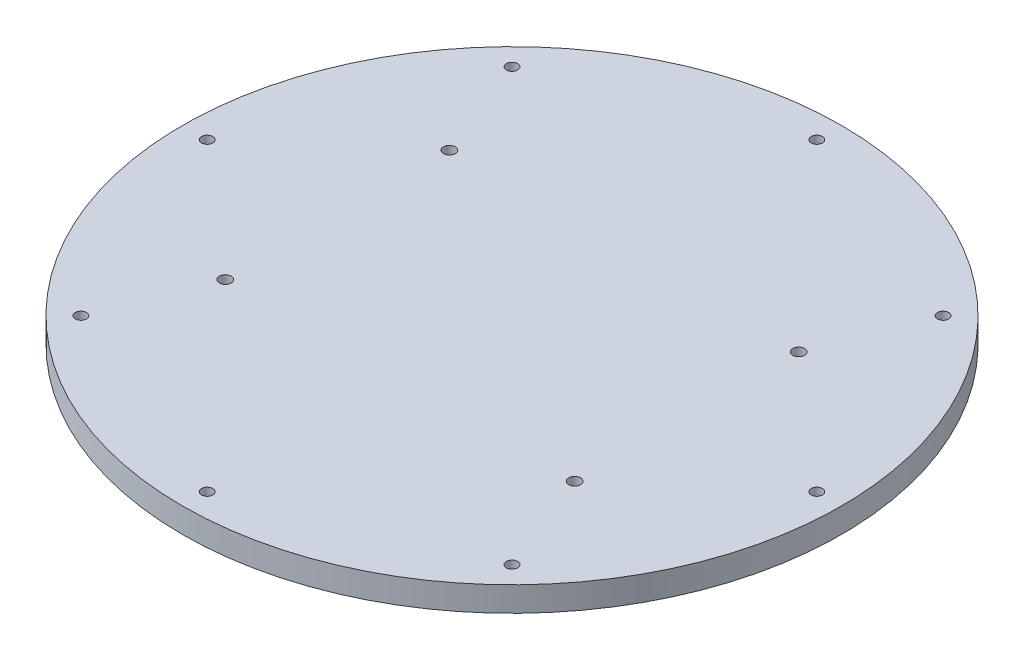
ISO-10303-21;
HEADER;
FILE_DESCRIPTION(('STEP AP214'),'2;1');
FILE_NAME('part.step','',(''),(''),'','','');
FILE_SCHEMA(('AUTOMOTIVE_DESIGN { 1 0 10303 214 1 1 1 1 }'));
ENDSEC;
DATA;
#1=APPLICATION_CONTEXT('core data for automotive mechanical design processes');
#2=APPLICATION_PROTOCOL_DEFINITION('international standard','automotive_design',2000,#1);
#3=PRODUCT_CONTEXT('',#1,'mechanical');
#4=PRODUCT('Part','Part','',(#3));
#5=PRODUCT_RELATED_PRODUCT_CATEGORY('part','',(#4));
#6=PRODUCT_DEFINITION_FORMATION('','',#4);
#7=PRODUCT_DEFINITION_CONTEXT('part definition',#1,'design');
#8=PRODUCT_DEFINITION('design','',#6,#7);
#9=PRODUCT_DEFINITION_SHAPE('','',#8);
#10=(LENGTH_UNIT() NAMED_UNIT(*) SI_UNIT(.MILLI.,.METRE.));
#11=(NAMED_UNIT(*) PLANE_ANGLE_UNIT() SI_UNIT($,.RADIAN.));
#12=(NAMED_UNIT(*) SI_UNIT($,.STERADIAN.) SOLID_ANGLE_UNIT());
#13=UNCERTAINTY_MEASURE_WITH_UNIT(LENGTH_MEASURE(1.E-05),#10,'distance_accuracy_value','');
#14=(GEOMETRIC_REPRESENTATION_CONTEXT(3) GLOBAL_UNCERTAINTY_ASSIGNED_CONTEXT((#13)) GLOBAL_UNIT_ASSIGNED_CONTEXT((#10,
#11,#12)) REPRESENTATION_CONTEXT('',''));
#15=CARTESIAN_POINT('',(0.,0.,0.));
#16=DIRECTION('',(0.,0.,1.));
#17=DIRECTION('',(1.,0.,0.));
#18=AXIS2_PLACEMENT_3D('',#15,#16,#17);
#19=CARTESIAN_POINT('',(0.,0.,0.));
#20=DIRECTION('',(0.,1.,0.));
#21=DIRECTION('',(0.,0.,1.));
#22=AXIS2_PLACEMENT_3D('',#19,#20,#21);
#23=PLANE('',#22);
#24=CARTESIAN_POINT('',(53.,0.,-34.));
#25=DIRECTION('',(0.,-1.,0.));
#26=DIRECTION('',(0.,0.,-1.));
#27=AXIS2_PLACEMENT_3D('',#24,#25,#26);
#28=CIRCLE('',#27,3.25);
#29=CARTESIAN_POINT('',(53.,0.,-37.25));
#30=VERTEX_POINT('',#29);
#31=EDGE_CURVE('E183',#30,#30,#28,.T.);
#32=ORIENTED_EDGE('',*,*,#31,.F.);
#33=EDGE_LOOP('',(#32));
#34=FACE_BOUND('',#33,.T.);
#35=CARTESIAN_POINT('',(-53.,0.,-34.));
#36=DIRECTION('',(0.,-1.,0.));
#37=DIRECTION('',(0.,0.,-1.));
#38=AXIS2_PLACEMENT_3D('',#35,#36,#37);
#39=CIRCLE('',#38,3.25);
#40=CARTESIAN_POINT('',(-53.,0.,-37.25));
#41=VERTEX_POINT('',#40);
#42=EDGE_CURVE('E171',#41,#41,#39,.T.);
#43=ORIENTED_EDGE('',*,*,#42,.F.);
#44=EDGE_LOOP('',(#43));
#45=FACE_BOUND('',#44,.T.);
#46=CARTESIAN_POINT('',(-53.,0.,34.));
#47=DIRECTION('',(0.,-1.,0.));
#48=DIRECTION('',(0.,0.,-1.));
#49=AXIS2_PLACEMENT_3D('',#46,#47,#48);
#50=CIRCLE('',#49,3.25);
#51=CARTESIAN_POINT('',(-53.,0.,30.75));
#52=VERTEX_POINT('',#51);
#53=EDGE_CURVE('E159',#52,#52,#50,.T.);
#54=ORIENTED_EDGE('',*,*,#53,.F.);
#55=EDGE_LOOP('',(#54));
#56=FACE_BOUND('',#55,.T.);
#57=CARTESIAN_POINT('',(0.,0.,92.5));
#58=DIRECTION('',(0.,-1.,0.));
#59=DIRECTION('',(0.,0.,-1.));
#60=AXIS2_PLACEMENT_3D('',#57,#58,#59);
#61=CIRCLE('',#60,3.25);
#62=CARTESIAN_POINT('',(0.,0.,89.25));
#63=VERTEX_POINT('',#62);
#64=EDGE_CURVE('E135',#63,#63,#61,.T.);
#65=ORIENTED_EDGE('',*,*,#64,.F.);
#66=EDGE_LOOP('',(#65));
#67=FACE_BOUND('',#66,.T.);
#68=CARTESIAN_POINT('',(65.4073772597558,0.,65.4073772597555));
#69=DIRECTION('',(0.,-1.,0.));
#70=DIRECTION('',(0.,0.,-1.));
#71=AXIS2_PLACEMENT_3D('',#68,#69,#70);
#72=CIRCLE('',#71,3.25);
#73=CARTESIAN_POINT('',(65.4073772597558,0.,62.1573772597555));
#74=VERTEX_POINT('',#73);
#75=EDGE_CURVE('E123',#74,#74,#72,.T.);
#76=ORIENTED_EDGE('',*,*,#75,.F.);
#77=EDGE_LOOP('',(#76));
#78=FACE_BOUND('',#77,.T.);
#79=CARTESIAN_POINT('',(92.5,0.,-3.22043538743629E-13));
#80=DIRECTION('',(0.,-1.,0.));
#81=DIRECTION('',(0.,0.,-1.));
#82=AXIS2_PLACEMENT_3D('',#79,#80,#81);
#83=CIRCLE('',#82,3.25);
#84=CARTESIAN_POINT('',(92.5,0.,-3.25000000000033));
#85=VERTEX_POINT('',#84);
#86=EDGE_CURVE('E111',#85,#85,#83,.T.);
#87=ORIENTED_EDGE('',*,*,#86,.F.);
#88=EDGE_LOOP('',(#87));
#89=FACE_BOUND('',#88,.T.);
#90=CARTESIAN_POINT('',(65.4073772597553,0.,-65.407377259756));
#91=DIRECTION('',(0.,-1.,0.));
#92=DIRECTION('',(0.,0.,-1.));
#93=AXIS2_PLACEMENT_3D('',#90,#91,#92);
#94=CIRCLE('',#93,3.25);
#95=CARTESIAN_POINT('',(65.4073772597553,0.,-68.657377259756));
#96=VERTEX_POINT('',#95);
#97=EDGE_CURVE('E99',#96,#96,#94,.T.);
#98=ORIENTED_EDGE('',*,*,#97,.F.);
#99=EDGE_LOOP('',(#98));
#100=FACE_BOUND('',#99,.T.);
#101=CARTESIAN_POINT('',(-6.45005562586619E-13,0.,-92.5));
#102=DIRECTION('',(0.,-1.,0.));
#103=DIRECTION('',(0.,0.,-1.));
#104=AXIS2_PLACEMENT_3D('',#101,#102,#103);
#105=CIRCLE('',#104,3.25);
#106=CARTESIAN_POINT('',(-6.45005562586619E-13,0.,-95.75));
#107=VERTEX_POINT('',#106);
#108=EDGE_CURVE('E87',#107,#107,#105,.T.);
#109=ORIENTED_EDGE('',*,*,#108,.F.);
#110=EDGE_LOOP('',(#109));
#111=FACE_BOUND('',#110,.T.);
#112=CARTESIAN_POINT('',(-65.4073772597562,0.,-65.4073772597551));
#113=DIRECTION('',(0.,-1.,0.));
#114=DIRECTION('',(0.,0.,-1.));
#115=AXIS2_PLACEMENT_3D('',#112,#113,#114);
#116=CIRCLE('',#115,3.25);
#117=CARTESIAN_POINT('',(-65.4073772597562,0.,-68.6573772597551));
#118=VERTEX_POINT('',#117);
#119=EDGE_CURVE('E75',#118,#118,#116,.T.);
#120=ORIENTED_EDGE('',*,*,#119,.F.);
#121=EDGE_LOOP('',(#120));
#122=FACE_BOUND('',#121,.T.);
#123=CARTESIAN_POINT('',(-92.5,0.,9.67967586429609E-13));
#124=DIRECTION('',(0.,-1.,0.));
#125=DIRECTION('',(0.,0.,-1.));
#126=AXIS2_PLACEMENT_3D('',#123,#124,#125);
#127=CIRCLE('',#126,3.25);
#128=CARTESIAN_POINT('',(-92.5,0.,-3.24999999999903));
#129=VERTEX_POINT('',#128);
#130=EDGE_CURVE('E63',#129,#129,#127,.T.);
#131=ORIENTED_EDGE('',*,*,#130,.F.);
#132=EDGE_LOOP('',(#131));
#133=FACE_BOUND('',#132,.T.);
#134=CARTESIAN_POINT('',(-65.4073772597548,0.,65.4073772597564));
#135=DIRECTION('',(0.,-1.,0.));
#136=DIRECTION('',(0.,0.,-1.));
#137=AXIS2_PLACEMENT_3D('',#134,#135,#136);
#138=CIRCLE('',#137,3.25);
#139=CARTESIAN_POINT('',(-65.4073772597548,0.,62.1573772597564));
#140=VERTEX_POINT('',#139);
#141=EDGE_CURVE('E51',#140,#140,#138,.T.);
#142=ORIENTED_EDGE('',*,*,#141,.F.);
#143=EDGE_LOOP('',(#142));
#144=FACE_BOUND('',#143,.T.);
#145=CARTESIAN_POINT('',(0.,0.,0.));
#146=DIRECTION('',(0.,1.,0.));
#147=DIRECTION('',(0.,0.,1.));
#148=AXIS2_PLACEMENT_3D('',#145,#146,#147);
#149=CIRCLE('',#148,100.);
#150=CARTESIAN_POINT('',(0.,0.,100.));
#151=VERTEX_POINT('',#150);
#152=EDGE_CURVE('E34',#151,#151,#149,.T.);
#153=ORIENTED_EDGE('',*,*,#152,.F.);
#154=EDGE_LOOP('',(#153));
#155=FACE_BOUND('',#154,.T.);
#156=CARTESIAN_POINT('',(53.,0.,34.));
#157=DIRECTION('',(0.,-1.,0.));
#158=DIRECTION('',(0.,0.,-1.));
#159=AXIS2_PLACEMENT_3D('',#156,#157,#158);
#160=CIRCLE('',#159,3.25);
#161=CARTESIAN_POINT('',(53.,0.,30.75));
#162=VERTEX_POINT('',#161);
#163=EDGE_CURVE('E147',#162,#162,#160,.T.);
#164=ORIENTED_EDGE('',*,*,#163,.F.);
#165=EDGE_LOOP('',(#164));
#166=FACE_BOUND('',#165,.T.);
#167=ADVANCED_FACE('F30',(#34,#45,#56,#67,#78,#89,#100,#111,#122,#133,#144,#155,#166),#23,.F.);
#168=CARTESIAN_POINT('',(0.,7.5,0.));
#169=DIRECTION('',(0.,-1.,0.));
#170=DIRECTION('',(0.,0.,-1.));
#171=AXIS2_PLACEMENT_3D('',#168,#169,#170);
#172=CYLINDRICAL_SURFACE('',#171,100.);
#173=CARTESIAN_POINT('',(0.,7.5,0.));
#174=DIRECTION('',(0.,1.,0.));
#175=DIRECTION('',(0.,0.,1.));
#176=AXIS2_PLACEMENT_3D('',#173,#174,#175);
#177=CIRCLE('',#176,100.);
#178=CARTESIAN_POINT('',(0.,7.5,100.));
#179=VERTEX_POINT('',#178);
#180=EDGE_CURVE('E10',#179,#179,#177,.T.);
#181=ORIENTED_EDGE('',*,*,#180,.F.);
#182=EDGE_LOOP('',(#181));
#183=FACE_BOUND('',#182,.T.);
#184=ORIENTED_EDGE('',*,*,#152,.T.);
#185=EDGE_LOOP('',(#184));
#186=FACE_BOUND('',#185,.T.);
#187=ADVANCED_FACE('F32',(#183,#186),#172,.T.);
#188=CARTESIAN_POINT('',(0.,7.5,0.));
#189=DIRECTION('',(0.,1.,0.));
#190=DIRECTION('',(0.,0.,1.));
#191=AXIS2_PLACEMENT_3D('',#188,#189,#190);
#192=PLANE('',#191);
#193=CARTESIAN_POINT('',(53.,7.5,-34.));
#194=DIRECTION('',(0.,-1.,0.));
#195=DIRECTION('',(0.,0.,-1.));
#196=AXIS2_PLACEMENT_3D('',#193,#194,#195);
#197=CIRCLE('',#196,1.8);
#198=CARTESIAN_POINT('',(53.,7.5,-35.8));
#199=VERTEX_POINT('',#198);
#200=EDGE_CURVE('E174',#199,#199,#197,.T.);
#201=ORIENTED_EDGE('',*,*,#200,.T.);
#202=EDGE_LOOP('',(#201));
#203=FACE_BOUND('',#202,.T.);
#204=CARTESIAN_POINT('',(-53.,7.5,-34.));
#205=DIRECTION('',(0.,-1.,0.));
#206=DIRECTION('',(0.,0.,-1.));
#207=AXIS2_PLACEMENT_3D('',#204,#205,#206);
#208=CIRCLE('',#207,1.8);
#209=CARTESIAN_POINT('',(-53.,7.5,-35.8));
#210=VERTEX_POINT('',#209);
#211=EDGE_CURVE('E162',#210,#210,#208,.T.);
#212=ORIENTED_EDGE('',*,*,#211,.T.);
#213=EDGE_LOOP('',(#212));
#214=FACE_BOUND('',#213,.T.);
#215=CARTESIAN_POINT('',(-53.,7.5,34.));
#216=DIRECTION('',(0.,-1.,0.));
#217=DIRECTION('',(0.,0.,-1.));
#218=AXIS2_PLACEMENT_3D('',#215,#216,#217);
#219=CIRCLE('',#218,1.8);
#220=CARTESIAN_POINT('',(-53.,7.5,32.2));
#221=VERTEX_POINT('',#220);
#222=EDGE_CURVE('E150',#221,#221,#219,.T.);
#223=ORIENTED_EDGE('',*,*,#222,.T.);
#224=EDGE_LOOP('',(#223));
#225=FACE_BOUND('',#224,.T.);
#226=CARTESIAN_POINT('',(53.,7.5,34.));
#227=DIRECTION('',(0.,-1.,0.));
#228=DIRECTION('',(0.,0.,-1.));
#229=AXIS2_PLACEMENT_3D('',#226,#227,#228);
#230=CIRCLE('',#229,1.8);
#231=CARTESIAN_POINT('',(53.,7.5,32.2));
#232=VERTEX_POINT('',#231);
#233=EDGE_CURVE('E138',#232,#232,#230,.T.);
#234=ORIENTED_EDGE('',*,*,#233,.T.);
#235=EDGE_LOOP('',(#234));
#236=FACE_BOUND('',#235,.T.);
#237=CARTESIAN_POINT('',(0.,7.5,92.5));
#238=DIRECTION('',(0.,-1.,0.));
#239=DIRECTION('',(0.,0.,-1.));
#240=AXIS2_PLACEMENT_3D('',#237,#238,#239);
#241=CIRCLE('',#240,1.7);
#242=CARTESIAN_POINT('',(0.,7.5,90.8));
#243=VERTEX_POINT('',#242);
#244=EDGE_CURVE('E126',#243,#243,#241,.T.);
#245=ORIENTED_EDGE('',*,*,#244,.T.);
#246=EDGE_LOOP('',(#245));
#247=FACE_BOUND('',#246,.T.);
#248=CARTESIAN_POINT('',(65.4073772597558,7.5,65.4073772597555));
#249=DIRECTION('',(0.,-1.,0.));
#250=DIRECTION('',(0.,0.,-1.));
#251=AXIS2_PLACEMENT_3D('',#248,#249,#250);
#252=CIRCLE('',#251,1.69999999999999);
#253=CARTESIAN_POINT('',(65.4073772597558,7.5,63.7073772597555));
#254=VERTEX_POINT('',#253);
#255=EDGE_CURVE('E114',#254,#254,#252,.T.);
#256=ORIENTED_EDGE('',*,*,#255,.T.);
#257=EDGE_LOOP('',(#256));
#258=FACE_BOUND('',#257,.T.);
#259=CARTESIAN_POINT('',(92.5,7.5,-3.22043538743629E-13));
#260=DIRECTION('',(0.,-1.,0.));
#261=DIRECTION('',(0.,0.,-1.));
#262=AXIS2_PLACEMENT_3D('',#259,#260,#261);
#263=CIRCLE('',#262,1.69999999999999);
#264=CARTESIAN_POINT('',(92.5,7.5,-1.70000000000032));
#265=VERTEX_POINT('',#264);
#266=EDGE_CURVE('E102',#265,#265,#263,.T.);
#267=ORIENTED_EDGE('',*,*,#266,.T.);
#268=EDGE_LOOP('',(#267));
#269=FACE_BOUND('',#268,.T.);
#270=CARTESIAN_POINT('',(65.4073772597553,7.5,-65.407377259756));
#271=DIRECTION('',(0.,-1.,0.));
#272=DIRECTION('',(0.,0.,-1.));
#273=AXIS2_PLACEMENT_3D('',#270,#271,#272);
#274=CIRCLE('',#273,1.69999999999999);
#275=CARTESIAN_POINT('',(65.4073772597553,7.5,-67.107377259756));
#276=VERTEX_POINT('',#275);
#277=EDGE_CURVE('E90',#276,#276,#274,.T.);
#278=ORIENTED_EDGE('',*,*,#277,.T.);
#279=EDGE_LOOP('',(#278));
#280=FACE_BOUND('',#279,.T.);
#281=CARTESIAN_POINT('',(-6.45005562586619E-13,7.5,-92.5));
#282=DIRECTION('',(0.,-1.,0.));
#283=DIRECTION('',(0.,0.,-1.));
#284=AXIS2_PLACEMENT_3D('',#281,#282,#283);
#285=CIRCLE('',#284,1.7);
#286=CARTESIAN_POINT('',(-6.45005562586619E-13,7.5,-94.2));
#287=VERTEX_POINT('',#286);
#288=EDGE_CURVE('E78',#287,#287,#285,.T.);
#289=ORIENTED_EDGE('',*,*,#288,.T.);
#290=EDGE_LOOP('',(#289));
#291=FACE_BOUND('',#290,.T.);
#292=CARTESIAN_POINT('',(-65.4073772597562,7.5,-65.4073772597551));
#293=DIRECTION('',(0.,-1.,0.));
#294=DIRECTION('',(0.,0.,-1.));
#295=AXIS2_PLACEMENT_3D('',#292,#293,#294);
#296=CIRCLE('',#295,1.69999999999999);
#297=CARTESIAN_POINT('',(-65.4073772597562,7.5,-67.1073772597551));
#298=VERTEX_POINT('',#297);
#299=EDGE_CURVE('E66',#298,#298,#296,.T.);
#300=ORIENTED_EDGE('',*,*,#299,.T.);
#301=EDGE_LOOP('',(#300));
#302=FACE_BOUND('',#301,.T.);
#303=CARTESIAN_POINT('',(-92.5,7.5,9.67967586429609E-13));
#304=DIRECTION('',(0.,-1.,0.));
#305=DIRECTION('',(0.,0.,-1.));
#306=AXIS2_PLACEMENT_3D('',#303,#304,#305);
#307=CIRCLE('',#306,1.69999999999999);
#308=CARTESIAN_POINT('',(-92.5,7.5,-1.69999999999903));
#309=VERTEX_POINT('',#308);
#310=EDGE_CURVE('E54',#309,#309,#307,.T.);
#311=ORIENTED_EDGE('',*,*,#310,.T.);
#312=EDGE_LOOP('',(#311));
#313=FACE_BOUND('',#312,.T.);
#314=CARTESIAN_POINT('',(-65.4073772597548,7.5,65.4073772597564));
#315=DIRECTION('',(0.,-1.,0.));
#316=DIRECTION('',(0.,0.,-1.));
#317=AXIS2_PLACEMENT_3D('',#314,#315,#316);
#318=CIRCLE('',#317,1.69999999999999);
#319=CARTESIAN_POINT('',(-65.4073772597548,7.5,63.7073772597564));
#320=VERTEX_POINT('',#319);
#321=EDGE_CURVE('E41',#320,#320,#318,.T.);
#322=ORIENTED_EDGE('',*,*,#321,.T.);
#323=EDGE_LOOP('',(#322));
#324=FACE_BOUND('',#323,.T.);
#325=ORIENTED_EDGE('',*,*,#180,.T.);
#326=EDGE_LOOP('',(#325));
#327=FACE_BOUND('',#326,.T.);
#328=ADVANCED_FACE('F332',(#203,#214,#225,#236,#247,#258,#269,#280,#291,#302,#313,#324,#327),
#192,.T.);
#329=CARTESIAN_POINT('',(-65.4073772597548,0.,65.4073772597564));
#330=DIRECTION('',(0.,-1.,0.));
#331=DIRECTION('',(0.,0.,-1.));
#332=AXIS2_PLACEMENT_3D('',#329,#330,#331);
#333=CYLINDRICAL_SURFACE('',#332,1.69999999999999);
#334=ORIENTED_EDGE('',*,*,#321,.F.);
#335=EDGE_LOOP('',(#334));
#336=FACE_BOUND('',#335,.T.);
#337=CARTESIAN_POINT('',(-65.4073772597548,3.,65.4073772597564));
#338=DIRECTION('',(0.,-1.,0.));
#339=DIRECTION('',(0.,0.,-1.));
#340=AXIS2_PLACEMENT_3D('',#337,#338,#339);
#341=CIRCLE('',#340,1.69999999999999);
#342=CARTESIAN_POINT('',(-65.4073772597548,3.,63.7073772597564));
#343=VERTEX_POINT('',#342);
#344=EDGE_CURVE('E45',#343,#343,#341,.T.);
#345=ORIENTED_EDGE('',*,*,#344,.T.);
#346=EDGE_LOOP('',(#345));
#347=FACE_BOUND('',#346,.T.);
#348=ADVANCED_FACE('F328',(#336,#347),#333,.F.);
#349=CARTESIAN_POINT('',(-63.7073772597548,3.,65.4073772597564));
#350=DIRECTION('',(0.,1.,0.));
#351=DIRECTION('',(0.,0.,1.));
#352=AXIS2_PLACEMENT_3D('',#349,#350,#351);
#353=PLANE('',#352);
#354=ORIENTED_EDGE('',*,*,#344,.F.);
#355=EDGE_LOOP('',(#354));
#356=FACE_BOUND('',#355,.T.);
#357=CARTESIAN_POINT('',(-65.4073772597548,3.,65.4073772597564));
#358=DIRECTION('',(0.,-1.,0.));
#359=DIRECTION('',(0.,0.,-1.));
#360=AXIS2_PLACEMENT_3D('',#357,#358,#359);
#361=CIRCLE('',#360,3.25);
#362=CARTESIAN_POINT('',(-65.4073772597548,3.,62.1573772597564));
#363=VERTEX_POINT('',#362);
#364=EDGE_CURVE('E48',#363,#363,#361,.T.);
#365=ORIENTED_EDGE('',*,*,#364,.T.);
#366=EDGE_LOOP('',(#365));
#367=FACE_BOUND('',#366,.T.);
#368=ADVANCED_FACE('F324',(#356,#367),#353,.F.);
#369=CARTESIAN_POINT('',(-65.4073772597548,0.,65.4073772597564));
#370=DIRECTION('',(0.,-1.,0.));
#371=DIRECTION('',(0.,0.,-1.));
#372=AXIS2_PLACEMENT_3D('',#369,#370,#371);
#373=CYLINDRICAL_SURFACE('',#372,3.25);
#374=ORIENTED_EDGE('',*,*,#364,.F.);
#375=EDGE_LOOP('',(#374));
#376=FACE_BOUND('',#375,.T.);
#377=ORIENTED_EDGE('',*,*,#141,.T.);
#378=EDGE_LOOP('',(#377));
#379=FACE_BOUND('',#378,.T.);
#380=ADVANCED_FACE('F320',(#376,#379),#373,.F.);
#381=CARTESIAN_POINT('',(-92.5,0.,9.67967586429609E-13));
#382=DIRECTION('',(0.,-1.,0.));
#383=DIRECTION('',(0.,0.,-1.));
#384=AXIS2_PLACEMENT_3D('',#381,#382,#383);
#385=CYLINDRICAL_SURFACE('',#384,1.69999999999999);
#386=ORIENTED_EDGE('',*,*,#310,.F.);
#387=EDGE_LOOP('',(#386));
#388=FACE_BOUND('',#387,.T.);
#389=CARTESIAN_POINT('',(-92.5,3.,9.67967586429609E-13));
#390=DIRECTION('',(0.,-1.,0.));
#391=DIRECTION('',(0.,0.,-1.));
#392=AXIS2_PLACEMENT_3D('',#389,#390,#391);
#393=CIRCLE('',#392,1.69999999999999);
#394=CARTESIAN_POINT('',(-92.5,3.,-1.69999999999903));
#395=VERTEX_POINT('',#394);
#396=EDGE_CURVE('E57',#395,#395,#393,.T.);
#397=ORIENTED_EDGE('',*,*,#396,.T.);
#398=EDGE_LOOP('',(#397));
#399=FACE_BOUND('',#398,.T.);
#400=ADVANCED_FACE('F316',(#388,#399),#385,.F.);
#401=CARTESIAN_POINT('',(-90.8,3.,9.67967586429609E-13));
#402=DIRECTION('',(0.,1.,0.));
#403=DIRECTION('',(0.,0.,1.));
#404=AXIS2_PLACEMENT_3D('',#401,#402,#403);
#405=PLANE('',#404);
#406=ORIENTED_EDGE('',*,*,#396,.F.);
#407=EDGE_LOOP('',(#406));
#408=FACE_BOUND('',#407,.T.);
#409=CARTESIAN_POINT('',(-92.5,3.,9.67967586429609E-13));
#410=DIRECTION('',(0.,-1.,0.));
#411=DIRECTION('',(0.,0.,-1.));
#412=AXIS2_PLACEMENT_3D('',#409,#410,#411);
#413=CIRCLE('',#412,3.25);
#414=CARTESIAN_POINT('',(-92.5,3.,-3.24999999999903));
#415=VERTEX_POINT('',#414);
#416=EDGE_CURVE('E60',#415,#415,#413,.T.);
#417=ORIENTED_EDGE('',*,*,#416,.T.);
#418=EDGE_LOOP('',(#417));
#419=FACE_BOUND('',#418,.T.);
#420=ADVANCED_FACE('F312',(#408,#419),#405,.F.);
#421=CARTESIAN_POINT('',(-92.5,0.,9.67967586429609E-13));
#422=DIRECTION('',(0.,-1.,0.));
#423=DIRECTION('',(0.,0.,-1.));
#424=AXIS2_PLACEMENT_3D('',#421,#422,#423);
#425=CYLINDRICAL_SURFACE('',#424,3.25);
#426=ORIENTED_EDGE('',*,*,#416,.F.);
#427=EDGE_LOOP('',(#426));
#428=FACE_BOUND('',#427,.T.);
#429=ORIENTED_EDGE('',*,*,#130,.T.);
#430=EDGE_LOOP('',(#429));
#431=FACE_BOUND('',#430,.T.);
#432=ADVANCED_FACE('F308',(#428,#431),#425,.F.);
#433=CARTESIAN_POINT('',(-65.4073772597562,0.,-65.4073772597551));
#434=DIRECTION('',(0.,-1.,0.));
#435=DIRECTION('',(0.,0.,-1.));
#436=AXIS2_PLACEMENT_3D('',#433,#434,#435);
#437=CYLINDRICAL_SURFACE('',#436,1.69999999999999);
#438=ORIENTED_EDGE('',*,*,#299,.F.);
#439=EDGE_LOOP('',(#438));
#440=FACE_BOUND('',#439,.T.);
#441=CARTESIAN_POINT('',(-65.4073772597562,3.,-65.4073772597551));
#442=DIRECTION('',(0.,-1.,0.));
#443=DIRECTION('',(0.,0.,-1.));
#444=AXIS2_PLACEMENT_3D('',#441,#442,#443);
#445=CIRCLE('',#444,1.69999999999999);
#446=CARTESIAN_POINT('',(-65.4073772597562,3.,-67.1073772597551));
#447=VERTEX_POINT('',#446);
#448=EDGE_CURVE('E69',#447,#447,#445,.T.);
#449=ORIENTED_EDGE('',*,*,#448,.T.);
#450=EDGE_LOOP('',(#449));
#451=FACE_BOUND('',#450,.T.);
#452=ADVANCED_FACE('F304',(#440,#451),#437,.F.);
#453=CARTESIAN_POINT('',(-63.7073772597563,3.,-65.4073772597551));
#454=DIRECTION('',(0.,1.,0.));
#455=DIRECTION('',(0.,0.,1.));
#456=AXIS2_PLACEMENT_3D('',#453,#454,#455);
#457=PLANE('',#456);
#458=ORIENTED_EDGE('',*,*,#448,.F.);
#459=EDGE_LOOP('',(#458));
#460=FACE_BOUND('',#459,.T.);
#461=CARTESIAN_POINT('',(-65.4073772597562,3.,-65.4073772597551));
#462=DIRECTION('',(0.,-1.,0.));
#463=DIRECTION('',(0.,0.,-1.));
#464=AXIS2_PLACEMENT_3D('',#461,#462,#463);
#465=CIRCLE('',#464,3.25);
#466=CARTESIAN_POINT('',(-65.4073772597562,3.,-68.6573772597551));
#467=VERTEX_POINT('',#466);
#468=EDGE_CURVE('E72',#467,#467,#465,.T.);
#469=ORIENTED_EDGE('',*,*,#468,.T.);
#470=EDGE_LOOP('',(#469));
#471=FACE_BOUND('',#470,.T.);
#472=ADVANCED_FACE('F300',(#460,#471),#457,.F.);
#473=CARTESIAN_POINT('',(-65.4073772597562,0.,-65.4073772597551));
#474=DIRECTION('',(0.,-1.,0.));
#475=DIRECTION('',(0.,0.,-1.));
#476=AXIS2_PLACEMENT_3D('',#473,#474,#475);
#477=CYLINDRICAL_SURFACE('',#476,3.25);
#478=ORIENTED_EDGE('',*,*,#468,.F.);
#479=EDGE_LOOP('',(#478));
#480=FACE_BOUND('',#479,.T.);
#481=ORIENTED_EDGE('',*,*,#119,.T.);
#482=EDGE_LOOP('',(#481));
#483=FACE_BOUND('',#482,.T.);
#484=ADVANCED_FACE('F296',(#480,#483),#477,.F.);
#485=CARTESIAN_POINT('',(-6.45005562586619E-13,0.,-92.5));
#486=DIRECTION('',(0.,-1.,0.));
#487=DIRECTION('',(0.,0.,-1.));
#488=AXIS2_PLACEMENT_3D('',#485,#486,#487);
#489=CYLINDRICAL_SURFACE('',#488,1.7);
#490=ORIENTED_EDGE('',*,*,#288,.F.);
#491=EDGE_LOOP('',(#490));
#492=FACE_BOUND('',#491,.T.);
#493=CARTESIAN_POINT('',(-6.45005562586619E-13,3.,-92.5));
#494=DIRECTION('',(0.,-1.,0.));
#495=DIRECTION('',(0.,0.,-1.));
#496=AXIS2_PLACEMENT_3D('',#493,#494,#495);
#497=CIRCLE('',#496,1.7);
#498=CARTESIAN_POINT('',(-6.45005562586619E-13,3.,-94.2));
#499=VERTEX_POINT('',#498);
#500=EDGE_CURVE('E81',#499,#499,#497,.T.);
#501=ORIENTED_EDGE('',*,*,#500,.T.);
#502=EDGE_LOOP('',(#501));
#503=FACE_BOUND('',#502,.T.);
#504=ADVANCED_FACE('F292',(#492,#503),#489,.F.);
#505=CARTESIAN_POINT('',(1.69999999999935,3.,-92.5));
#506=DIRECTION('',(0.,1.,0.));
#507=DIRECTION('',(0.,0.,1.));
#508=AXIS2_PLACEMENT_3D('',#505,#506,#507);
#509=PLANE('',#508);
#510=ORIENTED_EDGE('',*,*,#500,.F.);
#511=EDGE_LOOP('',(#510));
#512=FACE_BOUND('',#511,.T.);
#513=CARTESIAN_POINT('',(-6.45005562586619E-13,3.,-92.5));
#514=DIRECTION('',(0.,-1.,0.));
#515=DIRECTION('',(0.,0.,-1.));
#516=AXIS2_PLACEMENT_3D('',#513,#514,#515);
#517=CIRCLE('',#516,3.25);
#518=CARTESIAN_POINT('',(-6.45005562586619E-13,3.,-95.75));
#519=VERTEX_POINT('',#518);
#520=EDGE_CURVE('E84',#519,#519,#517,.T.);
#521=ORIENTED_EDGE('',*,*,#520,.T.);
#522=EDGE_LOOP('',(#521));
#523=FACE_BOUND('',#522,.T.);
#524=ADVANCED_FACE('F288',(#512,#523),#509,.F.);
#525=CARTESIAN_POINT('',(-6.45005562586619E-13,0.,-92.5));
#526=DIRECTION('',(0.,-1.,0.));
#527=DIRECTION('',(0.,0.,-1.));
#528=AXIS2_PLACEMENT_3D('',#525,#526,#527);
#529=CYLINDRICAL_SURFACE('',#528,3.25);
#530=ORIENTED_EDGE('',*,*,#520,.F.);
#531=EDGE_LOOP('',(#530));
#532=FACE_BOUND('',#531,.T.);
#533=ORIENTED_EDGE('',*,*,#108,.T.);
#534=EDGE_LOOP('',(#533));
#535=FACE_BOUND('',#534,.T.);
#536=ADVANCED_FACE('F284',(#532,#535),#529,.F.);
#537=CARTESIAN_POINT('',(65.4073772597553,0.,-65.407377259756));
#538=DIRECTION('',(0.,-1.,0.));
#539=DIRECTION('',(0.,0.,-1.));
#540=AXIS2_PLACEMENT_3D('',#537,#538,#539);
#541=CYLINDRICAL_SURFACE('',#540,1.69999999999999);
#542=ORIENTED_EDGE('',*,*,#277,.F.);
#543=EDGE_LOOP('',(#542));
#544=FACE_BOUND('',#543,.T.);
#545=CARTESIAN_POINT('',(65.4073772597553,3.,-65.407377259756));
#546=DIRECTION('',(0.,-1.,0.));
#547=DIRECTION('',(0.,0.,-1.));
#548=AXIS2_PLACEMENT_3D('',#545,#546,#547);
#549=CIRCLE('',#548,1.69999999999999);
#550=CARTESIAN_POINT('',(65.4073772597553,3.,-67.107377259756));
#551=VERTEX_POINT('',#550);
#552=EDGE_CURVE('E93',#551,#551,#549,.T.);
#553=ORIENTED_EDGE('',*,*,#552,.T.);
#554=EDGE_LOOP('',(#553));
#555=FACE_BOUND('',#554,.T.);
#556=ADVANCED_FACE('F280',(#544,#555),#541,.F.);
#557=CARTESIAN_POINT('',(67.1073772597553,3.,-65.407377259756));
#558=DIRECTION('',(0.,1.,0.));
#559=DIRECTION('',(0.,0.,1.));
#560=AXIS2_PLACEMENT_3D('',#557,#558,#559);
#561=PLANE('',#560);
#562=ORIENTED_EDGE('',*,*,#552,.F.);
#563=EDGE_LOOP('',(#562));
#564=FACE_BOUND('',#563,.T.);
#565=CARTESIAN_POINT('',(65.4073772597553,3.,-65.407377259756));
#566=DIRECTION('',(0.,-1.,0.));
#567=DIRECTION('',(0.,0.,-1.));
#568=AXIS2_PLACEMENT_3D('',#565,#566,#567);
#569=CIRCLE('',#568,3.25);
#570=CARTESIAN_POINT('',(65.4073772597553,3.,-68.657377259756));
#571=VERTEX_POINT('',#570);
#572=EDGE_CURVE('E96',#571,#571,#569,.T.);
#573=ORIENTED_EDGE('',*,*,#572,.T.);
#574=EDGE_LOOP('',(#573));
#575=FACE_BOUND('',#574,.T.);
#576=ADVANCED_FACE('F276',(#564,#575),#561,.F.);
#577=CARTESIAN_POINT('',(65.4073772597553,0.,-65.407377259756));
#578=DIRECTION('',(0.,-1.,0.));
#579=DIRECTION('',(0.,0.,-1.));
#580=AXIS2_PLACEMENT_3D('',#577,#578,#579);
#581=CYLINDRICAL_SURFACE('',#580,3.25);
#582=ORIENTED_EDGE('',*,*,#572,.F.);
#583=EDGE_LOOP('',(#582));
#584=FACE_BOUND('',#583,.T.);
#585=ORIENTED_EDGE('',*,*,#97,.T.);
#586=EDGE_LOOP('',(#585));
#587=FACE_BOUND('',#586,.T.);
#588=ADVANCED_FACE('F272',(#584,#587),#581,.F.);
#589=CARTESIAN_POINT('',(92.5,0.,-3.22043538743629E-13));
#590=DIRECTION('',(0.,-1.,0.));
#591=DIRECTION('',(0.,0.,-1.));
#592=AXIS2_PLACEMENT_3D('',#589,#590,#591);
#593=CYLINDRICAL_SURFACE('',#592,1.69999999999999);
#594=ORIENTED_EDGE('',*,*,#266,.F.);
#595=EDGE_LOOP('',(#594));
#596=FACE_BOUND('',#595,.T.);
#597=CARTESIAN_POINT('',(92.5,3.,-3.22043538743629E-13));
#598=DIRECTION('',(0.,-1.,0.));
#599=DIRECTION('',(0.,0.,-1.));
#600=AXIS2_PLACEMENT_3D('',#597,#598,#599);
#601=CIRCLE('',#600,1.69999999999999);
#602=CARTESIAN_POINT('',(92.5,3.,-1.70000000000032));
#603=VERTEX_POINT('',#602);
#604=EDGE_CURVE('E105',#603,#603,#601,.T.);
#605=ORIENTED_EDGE('',*,*,#604,.T.);
#606=EDGE_LOOP('',(#605));
#607=FACE_BOUND('',#606,.T.);
#608=ADVANCED_FACE('F268',(#596,#607),#593,.F.);
#609=CARTESIAN_POINT('',(94.2,3.,-3.22043538743629E-13));
#610=DIRECTION('',(0.,1.,0.));
#611=DIRECTION('',(0.,0.,1.));
#612=AXIS2_PLACEMENT_3D('',#609,#610,#611);
#613=PLANE('',#612);
#614=ORIENTED_EDGE('',*,*,#604,.F.);
#615=EDGE_LOOP('',(#614));
#616=FACE_BOUND('',#615,.T.);
#617=CARTESIAN_POINT('',(92.5,3.,-3.22043538743629E-13));
#618=DIRECTION('',(0.,-1.,0.));
#619=DIRECTION('',(0.,0.,-1.));
#620=AXIS2_PLACEMENT_3D('',#617,#618,#619);
#621=CIRCLE('',#620,3.25);
#622=CARTESIAN_POINT('',(92.5,3.,-3.25000000000033));
#623=VERTEX_POINT('',#622);
#624=EDGE_CURVE('E108',#623,#623,#621,.T.);
#625=ORIENTED_EDGE('',*,*,#624,.T.);
#626=EDGE_LOOP('',(#625));
#627=FACE_BOUND('',#626,.T.);
#628=ADVANCED_FACE('F264',(#616,#627),#613,.F.);
#629=CARTESIAN_POINT('',(92.5,0.,-3.22043538743629E-13));
#630=DIRECTION('',(0.,-1.,0.));
#631=DIRECTION('',(0.,0.,-1.));
#632=AXIS2_PLACEMENT_3D('',#629,#630,#631);
#633=CYLINDRICAL_SURFACE('',#632,3.25);
#634=ORIENTED_EDGE('',*,*,#624,.F.);
#635=EDGE_LOOP('',(#634));
#636=FACE_BOUND('',#635,.T.);
#637=ORIENTED_EDGE('',*,*,#86,.T.);
#638=EDGE_LOOP('',(#637));
#639=FACE_BOUND('',#638,.T.);
#640=ADVANCED_FACE('F260',(#636,#639),#633,.F.);
#641=CARTESIAN_POINT('',(65.4073772597558,0.,65.4073772597555));
#642=DIRECTION('',(0.,-1.,0.));
#643=DIRECTION('',(0.,0.,-1.));
#644=AXIS2_PLACEMENT_3D('',#641,#642,#643);
#645=CYLINDRICAL_SURFACE('',#644,1.69999999999999);
#646=ORIENTED_EDGE('',*,*,#255,.F.);
#647=EDGE_LOOP('',(#646));
#648=FACE_BOUND('',#647,.T.);
#649=CARTESIAN_POINT('',(65.4073772597558,3.,65.4073772597555));
#650=DIRECTION('',(0.,-1.,0.));
#651=DIRECTION('',(0.,0.,-1.));
#652=AXIS2_PLACEMENT_3D('',#649,#650,#651);
#653=CIRCLE('',#652,1.69999999999999);
#654=CARTESIAN_POINT('',(65.4073772597558,3.,63.7073772597555));
#655=VERTEX_POINT('',#654);
#656=EDGE_CURVE('E117',#655,#655,#653,.T.);
#657=ORIENTED_EDGE('',*,*,#656,.T.);
#658=EDGE_LOOP('',(#657));
#659=FACE_BOUND('',#658,.T.);
#660=ADVANCED_FACE('F256',(#648,#659),#645,.F.);
#661=CARTESIAN_POINT('',(67.1073772597558,3.,65.4073772597555));
#662=DIRECTION('',(0.,1.,0.));
#663=DIRECTION('',(0.,0.,1.));
#664=AXIS2_PLACEMENT_3D('',#661,#662,#663);
#665=PLANE('',#664);
#666=ORIENTED_EDGE('',*,*,#656,.F.);
#667=EDGE_LOOP('',(#666));
#668=FACE_BOUND('',#667,.T.);
#669=CARTESIAN_POINT('',(65.4073772597558,3.,65.4073772597555));
#670=DIRECTION('',(0.,-1.,0.));
#671=DIRECTION('',(0.,0.,-1.));
#672=AXIS2_PLACEMENT_3D('',#669,#670,#671);
#673=CIRCLE('',#672,3.25);
#674=CARTESIAN_POINT('',(65.4073772597558,3.,62.1573772597555));
#675=VERTEX_POINT('',#674);
#676=EDGE_CURVE('E120',#675,#675,#673,.T.);
#677=ORIENTED_EDGE('',*,*,#676,.T.);
#678=EDGE_LOOP('',(#677));
#679=FACE_BOUND('',#678,.T.);
#680=ADVANCED_FACE('F252',(#668,#679),#665,.F.);
#681=CARTESIAN_POINT('',(65.4073772597558,0.,65.4073772597555));
#682=DIRECTION('',(0.,-1.,0.));
#683=DIRECTION('',(0.,0.,-1.));
#684=AXIS2_PLACEMENT_3D('',#681,#682,#683);
#685=CYLINDRICAL_SURFACE('',#684,3.25);
#686=ORIENTED_EDGE('',*,*,#676,.F.);
#687=EDGE_LOOP('',(#686));
#688=FACE_BOUND('',#687,.T.);
#689=ORIENTED_EDGE('',*,*,#75,.T.);
#690=EDGE_LOOP('',(#689));
#691=FACE_BOUND('',#690,.T.);
#692=ADVANCED_FACE('F248',(#688,#691),#685,.F.);
#693=CARTESIAN_POINT('',(0.,0.,92.5));
#694=DIRECTION('',(0.,-1.,0.));
#695=DIRECTION('',(0.,0.,-1.));
#696=AXIS2_PLACEMENT_3D('',#693,#694,#695);
#697=CYLINDRICAL_SURFACE('',#696,1.7);
#698=ORIENTED_EDGE('',*,*,#244,.F.);
#699=EDGE_LOOP('',(#698));
#700=FACE_BOUND('',#699,.T.);
#701=CARTESIAN_POINT('',(0.,3.,92.5));
#702=DIRECTION('',(0.,-1.,0.));
#703=DIRECTION('',(0.,0.,-1.));
#704=AXIS2_PLACEMENT_3D('',#701,#702,#703);
#705=CIRCLE('',#704,1.7);
#706=CARTESIAN_POINT('',(0.,3.,90.8));
#707=VERTEX_POINT('',#706);
#708=EDGE_CURVE('E129',#707,#707,#705,.T.);
#709=ORIENTED_EDGE('',*,*,#708,.T.);
#710=EDGE_LOOP('',(#709));
#711=FACE_BOUND('',#710,.T.);
#712=ADVANCED_FACE('F244',(#700,#711),#697,.F.);
#713=CARTESIAN_POINT('',(1.7,3.,92.5));
#714=DIRECTION('',(0.,1.,0.));
#715=DIRECTION('',(0.,0.,1.));
#716=AXIS2_PLACEMENT_3D('',#713,#714,#715);
#717=PLANE('',#716);
#718=ORIENTED_EDGE('',*,*,#708,.F.);
#719=EDGE_LOOP('',(#718));
#720=FACE_BOUND('',#719,.T.);
#721=CARTESIAN_POINT('',(0.,3.,92.5));
#722=DIRECTION('',(0.,-1.,0.));
#723=DIRECTION('',(0.,0.,-1.));
#724=AXIS2_PLACEMENT_3D('',#721,#722,#723);
#725=CIRCLE('',#724,3.25);
#726=CARTESIAN_POINT('',(0.,3.,89.25));
#727=VERTEX_POINT('',#726);
#728=EDGE_CURVE('E132',#727,#727,#725,.T.);
#729=ORIENTED_EDGE('',*,*,#728,.T.);
#730=EDGE_LOOP('',(#729));
#731=FACE_BOUND('',#730,.T.);
#732=ADVANCED_FACE('F240',(#720,#731),#717,.F.);
#733=CARTESIAN_POINT('',(0.,0.,92.5));
#734=DIRECTION('',(0.,-1.,0.));
#735=DIRECTION('',(0.,0.,-1.));
#736=AXIS2_PLACEMENT_3D('',#733,#734,#735);
#737=CYLINDRICAL_SURFACE('',#736,3.25);
#738=ORIENTED_EDGE('',*,*,#728,.F.);
#739=EDGE_LOOP('',(#738));
#740=FACE_BOUND('',#739,.T.);
#741=ORIENTED_EDGE('',*,*,#64,.T.);
#742=EDGE_LOOP('',(#741));
#743=FACE_BOUND('',#742,.T.);
#744=ADVANCED_FACE('F236',(#740,#743),#737,.F.);
#745=CARTESIAN_POINT('',(53.,0.,34.));
#746=DIRECTION('',(0.,-1.,0.));
#747=DIRECTION('',(0.,0.,-1.));
#748=AXIS2_PLACEMENT_3D('',#745,#746,#747);
#749=CYLINDRICAL_SURFACE('',#748,1.8);
#750=ORIENTED_EDGE('',*,*,#233,.F.);
#751=EDGE_LOOP('',(#750));
#752=FACE_BOUND('',#751,.T.);
#753=CARTESIAN_POINT('',(53.,3.,34.));
#754=DIRECTION('',(0.,-1.,0.));
#755=DIRECTION('',(0.,0.,-1.));
#756=AXIS2_PLACEMENT_3D('',#753,#754,#755);
#757=CIRCLE('',#756,1.8);
#758=CARTESIAN_POINT('',(53.,3.,32.2));
#759=VERTEX_POINT('',#758);
#760=EDGE_CURVE('E141',#759,#759,#757,.T.);
#761=ORIENTED_EDGE('',*,*,#760,.T.);
#762=EDGE_LOOP('',(#761));
#763=FACE_BOUND('',#762,.T.);
#764=ADVANCED_FACE('F228',(#752,#763),#749,.F.);
#765=CARTESIAN_POINT('',(54.8,3.,34.));
#766=DIRECTION('',(0.,1.,0.));
#767=DIRECTION('',(0.,0.,1.));
#768=AXIS2_PLACEMENT_3D('',#765,#766,#767);
#769=PLANE('',#768);
#770=ORIENTED_EDGE('',*,*,#760,.F.);
#771=EDGE_LOOP('',(#770));
#772=FACE_BOUND('',#771,.T.);
#773=CARTESIAN_POINT('',(53.,3.,34.));
#774=DIRECTION('',(0.,-1.,0.));
#775=DIRECTION('',(0.,0.,-1.));
#776=AXIS2_PLACEMENT_3D('',#773,#774,#775);
#777=CIRCLE('',#776,3.25);
#778=CARTESIAN_POINT('',(53.,3.,30.75));
#779=VERTEX_POINT('',#778);
#780=EDGE_CURVE('E144',#779,#779,#777,.T.);
#781=ORIENTED_EDGE('',*,*,#780,.T.);
#782=EDGE_LOOP('',(#781));
#783=FACE_BOUND('',#782,.T.);
#784=ADVANCED_FACE('F218',(#772,#783),#769,.F.);
#785=CARTESIAN_POINT('',(53.,0.,34.));
#786=DIRECTION('',(0.,-1.,0.));
#787=DIRECTION('',(0.,0.,-1.));
#788=AXIS2_PLACEMENT_3D('',#785,#786,#787);
#789=CYLINDRICAL_SURFACE('',#788,3.25);
#790=ORIENTED_EDGE('',*,*,#780,.F.);
#791=EDGE_LOOP('',(#790));
#792=FACE_BOUND('',#791,.T.);
#793=ORIENTED_EDGE('',*,*,#163,.T.);
#794=EDGE_LOOP('',(#793));
#795=FACE_BOUND('',#794,.T.);
#796=ADVANCED_FACE('F215',(#792,#795),#789,.F.);
#797=CARTESIAN_POINT('',(-53.,0.,34.));
#798=DIRECTION('',(0.,-1.,0.));
#799=DIRECTION('',(0.,0.,-1.));
#800=AXIS2_PLACEMENT_3D('',#797,#798,#799);
#801=CYLINDRICAL_SURFACE('',#800,1.8);
#802=ORIENTED_EDGE('',*,*,#222,.F.);
#803=EDGE_LOOP('',(#802));
#804=FACE_BOUND('',#803,.T.);
#805=CARTESIAN_POINT('',(-53.,3.,34.));
#806=DIRECTION('',(0.,-1.,0.));
#807=DIRECTION('',(0.,0.,-1.));
#808=AXIS2_PLACEMENT_3D('',#805,#806,#807);
#809=CIRCLE('',#808,1.8);
#810=CARTESIAN_POINT('',(-53.,3.,32.2));
#811=VERTEX_POINT('',#810);
#812=EDGE_CURVE('E153',#811,#811,#809,.T.);
#813=ORIENTED_EDGE('',*,*,#812,.T.);
#814=EDGE_LOOP('',(#813));
#815=FACE_BOUND('',#814,.T.);
#816=ADVANCED_FACE('F217',(#804,#815),#801,.F.);
#817=CARTESIAN_POINT('',(-51.2,3.,34.));
#818=DIRECTION('',(0.,1.,0.));
#819=DIRECTION('',(0.,0.,1.));
#820=AXIS2_PLACEMENT_3D('',#817,#818,#819);
#821=PLANE('',#820);
#822=ORIENTED_EDGE('',*,*,#812,.F.);
#823=EDGE_LOOP('',(#822));
#824=FACE_BOUND('',#823,.T.);
#825=CARTESIAN_POINT('',(-53.,3.,34.));
#826=DIRECTION('',(0.,-1.,0.));
#827=DIRECTION('',(0.,0.,-1.));
#828=AXIS2_PLACEMENT_3D('',#825,#826,#827);
#829=CIRCLE('',#828,3.25);
#830=CARTESIAN_POINT('',(-53.,3.,30.75));
#831=VERTEX_POINT('',#830);
#832=EDGE_CURVE('E156',#831,#831,#829,.T.);
#833=ORIENTED_EDGE('',*,*,#832,.T.);
#834=EDGE_LOOP('',(#833));
#835=FACE_BOUND('',#834,.T.);
#836=ADVANCED_FACE('F225',(#824,#835),#821,.F.);
#837=CARTESIAN_POINT('',(-53.,0.,34.));
#838=DIRECTION('',(0.,-1.,0.));
#839=DIRECTION('',(0.,0.,-1.));
#840=AXIS2_PLACEMENT_3D('',#837,#838,#839);
#841=CYLINDRICAL_SURFACE('',#840,3.25);
#842=ORIENTED_EDGE('',*,*,#832,.F.);
#843=EDGE_LOOP('',(#842));
#844=FACE_BOUND('',#843,.T.);
#845=ORIENTED_EDGE('',*,*,#53,.T.);
#846=EDGE_LOOP('',(#845));
#847=FACE_BOUND('',#846,.T.);
#848=ADVANCED_FACE('F411',(#844,#847),#841,.F.);
#849=CARTESIAN_POINT('',(-53.,0.,-34.));
#850=DIRECTION('',(0.,-1.,0.));
#851=DIRECTION('',(0.,0.,-1.));
#852=AXIS2_PLACEMENT_3D('',#849,#850,#851);
#853=CYLINDRICAL_SURFACE('',#852,1.8);
#854=ORIENTED_EDGE('',*,*,#211,.F.);
#855=EDGE_LOOP('',(#854));
#856=FACE_BOUND('',#855,.T.);
#857=CARTESIAN_POINT('',(-53.,3.,-34.));
#858=DIRECTION('',(0.,-1.,0.));
#859=DIRECTION('',(0.,0.,-1.));
#860=AXIS2_PLACEMENT_3D('',#857,#858,#859);
#861=CIRCLE('',#860,1.8);
#862=CARTESIAN_POINT('',(-53.,3.,-35.8));
#863=VERTEX_POINT('',#862);
#864=EDGE_CURVE('E165',#863,#863,#861,.T.);
#865=ORIENTED_EDGE('',*,*,#864,.T.);
#866=EDGE_LOOP('',(#865));
#867=FACE_BOUND('',#866,.T.);
#868=ADVANCED_FACE('F416',(#856,#867),#853,.F.);
#869=CARTESIAN_POINT('',(-51.2,3.,-34.));
#870=DIRECTION('',(0.,1.,0.));
#871=DIRECTION('',(0.,0.,1.));
#872=AXIS2_PLACEMENT_3D('',#869,#870,#871);
#873=PLANE('',#872);
#874=ORIENTED_EDGE('',*,*,#864,.F.);
#875=EDGE_LOOP('',(#874));
#876=FACE_BOUND('',#875,.T.);
#877=CARTESIAN_POINT('',(-53.,3.,-34.));
#878=DIRECTION('',(0.,-1.,0.));
#879=DIRECTION('',(0.,0.,-1.));
#880=AXIS2_PLACEMENT_3D('',#877,#878,#879);
#881=CIRCLE('',#880,3.25);
#882=CARTESIAN_POINT('',(-53.,3.,-37.25));
#883=VERTEX_POINT('',#882);
#884=EDGE_CURVE('E168',#883,#883,#881,.T.);
#885=ORIENTED_EDGE('',*,*,#884,.T.);
#886=EDGE_LOOP('',(#885));
#887=FACE_BOUND('',#886,.T.);
#888=ADVANCED_FACE('F421',(#876,#887),#873,.F.);
#889=CARTESIAN_POINT('',(-53.,0.,-34.));
#890=DIRECTION('',(0.,-1.,0.));
#891=DIRECTION('',(0.,0.,-1.));
#892=AXIS2_PLACEMENT_3D('',#889,#890,#891);
#893=CYLINDRICAL_SURFACE('',#892,3.25);
#894=ORIENTED_EDGE('',*,*,#884,.F.);
#895=EDGE_LOOP('',(#894));
#896=FACE_BOUND('',#895,.T.);
#897=ORIENTED_EDGE('',*,*,#42,.T.);
#898=EDGE_LOOP('',(#897));
#899=FACE_BOUND('',#898,.T.);
#900=ADVANCED_FACE('F427',(#896,#899),#893,.F.);
#901=CARTESIAN_POINT('',(53.,0.,-34.));
#902=DIRECTION('',(0.,-1.,0.));
#903=DIRECTION('',(0.,0.,-1.));
#904=AXIS2_PLACEMENT_3D('',#901,#902,#903);
#905=CYLINDRICAL_SURFACE('',#904,1.8);
#906=ORIENTED_EDGE('',*,*,#200,.F.);
#907=EDGE_LOOP('',(#906));
#908=FACE_BOUND('',#907,.T.);
#909=CARTESIAN_POINT('',(53.,3.,-34.));
#910=DIRECTION('',(0.,-1.,0.));
#911=DIRECTION('',(0.,0.,-1.));
#912=AXIS2_PLACEMENT_3D('',#909,#910,#911);
#913=CIRCLE('',#912,1.8);
#914=CARTESIAN_POINT('',(53.,3.,-35.8));
#915=VERTEX_POINT('',#914);
#916=EDGE_CURVE('E177',#915,#915,#913,.T.);
#917=ORIENTED_EDGE('',*,*,#916,.T.);
#918=EDGE_LOOP('',(#917));
#919=FACE_BOUND('',#918,.T.);
#920=ADVANCED_FACE('F431',(#908,#919),#905,.F.);
#921=CARTESIAN_POINT('',(54.8,3.,-34.));
#922=DIRECTION('',(0.,1.,0.));
#923=DIRECTION('',(0.,0.,1.));
#924=AXIS2_PLACEMENT_3D('',#921,#922,#923);
#925=PLANE('',#924);
#926=ORIENTED_EDGE('',*,*,#916,.F.);
#927=EDGE_LOOP('',(#926));
#928=FACE_BOUND('',#927,.T.);
#929=CARTESIAN_POINT('',(53.,3.,-34.));
#930=DIRECTION('',(0.,-1.,0.));
#931=DIRECTION('',(0.,0.,-1.));
#932=AXIS2_PLACEMENT_3D('',#929,#930,#931);
#933=CIRCLE('',#932,3.25);
#934=CARTESIAN_POINT('',(53.,3.,-37.25));
#935=VERTEX_POINT('',#934);
#936=EDGE_CURVE('E180',#935,#935,#933,.T.);
#937=ORIENTED_EDGE('',*,*,#936,.T.);
#938=EDGE_LOOP('',(#937));
#939=FACE_BOUND('',#938,.T.);
#940=ADVANCED_FACE('F435',(#928,#939),#925,.F.);
#941=CARTESIAN_POINT('',(53.,0.,-34.));
#942=DIRECTION('',(0.,-1.,0.));
#943=DIRECTION('',(0.,0.,-1.));
#944=AXIS2_PLACEMENT_3D('',#941,#942,#943);
#945=CYLINDRICAL_SURFACE('',#944,3.25);
#946=ORIENTED_EDGE('',*,*,#936,.F.);
#947=EDGE_LOOP('',(#946));
#948=FACE_BOUND('',#947,.T.);
#949=ORIENTED_EDGE('',*,*,#31,.T.);
#950=EDGE_LOOP('',(#949));
#951=FACE_BOUND('',#950,.T.);
#952=ADVANCED_FACE('F187',(#948,#951),#945,.F.);
#953=CLOSED_SHELL('',(#167,#187,#328,#348,#368,#380,#400,#420,#432,#452,#472,#484,#504,#524,
#536,#556,#576,#588,#608,#628,#640,#660,#680,#692,#712,#732,#744,#764,#784,#796,#816,#836,#848,
#868,#888,#900,#920,#940,#952));
#954=MANIFOLD_SOLID_BREP('B2',#953);
#955=ADVANCED_BREP_SHAPE_REPRESENTATION('',(#18,#954),#14);
#956=SHAPE_DEFINITION_REPRESENTATION(#9,#955);
ENDSEC;
END-ISO-10303-21;
